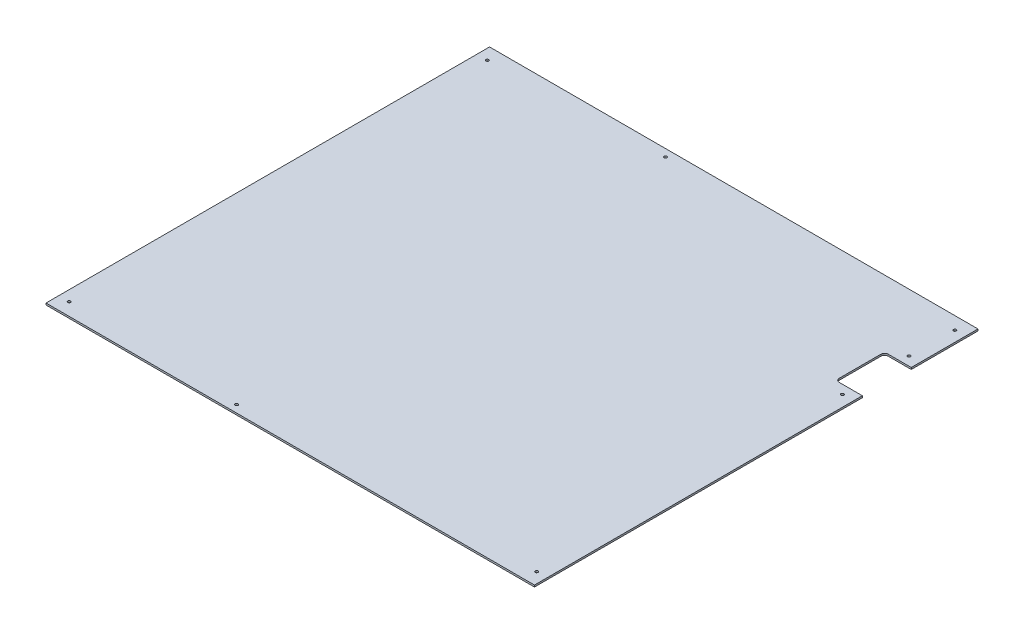
ISO-10303-21;
HEADER;
FILE_DESCRIPTION(('STEP AP214'),'2;1');
FILE_NAME('part.step','',(''),(''),'','','');
FILE_SCHEMA(('AUTOMOTIVE_DESIGN { 1 0 10303 214 1 1 1 1 }'));
ENDSEC;
DATA;
#1=APPLICATION_CONTEXT('core data for automotive mechanical design processes');
#2=APPLICATION_PROTOCOL_DEFINITION('international standard','automotive_design',2000,#1);
#3=PRODUCT_CONTEXT('',#1,'mechanical');
#4=PRODUCT('Part','Part','',(#3));
#5=PRODUCT_RELATED_PRODUCT_CATEGORY('part','',(#4));
#6=PRODUCT_DEFINITION_FORMATION('','',#4);
#7=PRODUCT_DEFINITION_CONTEXT('part definition',#1,'design');
#8=PRODUCT_DEFINITION('design','',#6,#7);
#9=PRODUCT_DEFINITION_SHAPE('','',#8);
#10=(LENGTH_UNIT() NAMED_UNIT(*) SI_UNIT(.MILLI.,.METRE.));
#11=(NAMED_UNIT(*) PLANE_ANGLE_UNIT() SI_UNIT($,.RADIAN.));
#12=(NAMED_UNIT(*) SI_UNIT($,.STERADIAN.) SOLID_ANGLE_UNIT());
#13=UNCERTAINTY_MEASURE_WITH_UNIT(LENGTH_MEASURE(1.E-05),#10,'distance_accuracy_value','');
#14=(GEOMETRIC_REPRESENTATION_CONTEXT(3) GLOBAL_UNCERTAINTY_ASSIGNED_CONTEXT((#13)) GLOBAL_UNIT_ASSIGNED_CONTEXT((#10,
#11,#12)) REPRESENTATION_CONTEXT('',''));
#15=CARTESIAN_POINT('',(0.,0.,0.));
#16=DIRECTION('',(0.,0.,1.));
#17=DIRECTION('',(1.,0.,0.));
#18=AXIS2_PLACEMENT_3D('',#15,#16,#17);
#19=CARTESIAN_POINT('',(549.75,-743.673483458971,-0.750000000000034));
#20=DIRECTION('',(1.,0.,0.));
#21=DIRECTION('',(0.,0.,-1.));
#22=AXIS2_PLACEMENT_3D('',#19,#20,#21);
#23=PLANE('',#22);
#24=DIRECTION('',(0.,1.,0.));
#25=VECTOR('',#24,1.);
#26=CARTESIAN_POINT('',(549.75,-62.6498204307084,-424.25));
#27=LINE('',#26,#25);
#28=CARTESIAN_POINT('',(549.75,0.,-424.25));
#29=VERTEX_POINT('',#28);
#30=CARTESIAN_POINT('',(549.75,2.,-424.25));
#31=VERTEX_POINT('',#30);
#32=EDGE_CURVE('E124',#29,#31,#27,.T.);
#33=ORIENTED_EDGE('',*,*,#32,.F.);
#34=DIRECTION('',(0.,0.,-1.));
#35=VECTOR('',#34,1.);
#36=CARTESIAN_POINT('',(549.75,0.,-0.750000000000034));
#37=LINE('',#36,#35);
#38=CARTESIAN_POINT('',(549.75,0.,-499.25));
#39=VERTEX_POINT('',#38);
#40=EDGE_CURVE('E162',#29,#39,#37,.T.);
#41=ORIENTED_EDGE('',*,*,#40,.T.);
#42=DIRECTION('',(0.,1.,0.));
#43=VECTOR('',#42,1.);
#44=CARTESIAN_POINT('',(549.75,-743.673483458971,-499.25));
#45=LINE('',#44,#43);
#46=CARTESIAN_POINT('',(549.75,2.,-499.25));
#47=VERTEX_POINT('',#46);
#48=EDGE_CURVE('E144',#39,#47,#45,.T.);
#49=ORIENTED_EDGE('',*,*,#48,.T.);
#50=DIRECTION('',(0.,0.,-1.));
#51=VECTOR('',#50,1.);
#52=CARTESIAN_POINT('',(549.75,2.,-0.750000000000034));
#53=LINE('',#52,#51);
#54=EDGE_CURVE('E137',#31,#47,#53,.T.);
#55=ORIENTED_EDGE('',*,*,#54,.F.);
#56=EDGE_LOOP('',(#33,#41,#49,#55));
#57=FACE_BOUND('',#56,.T.);
#58=ADVANCED_FACE('F39',(#57),#23,.T.);
#59=CARTESIAN_POINT('',(0.,2.,0.));
#60=DIRECTION('',(0.,-1.,0.));
#61=DIRECTION('',(0.,0.,-1.));
#62=AXIS2_PLACEMENT_3D('',#59,#60,#61);
#63=PLANE('',#62);
#64=CARTESIAN_POINT('',(206.75,2.,-491.));
#65=DIRECTION('',(0.,1.,0.));
#66=DIRECTION('',(0.,0.,1.));
#67=AXIS2_PLACEMENT_3D('',#64,#65,#66);
#68=CIRCLE('',#67,1.59999999999999);
#69=CARTESIAN_POINT('',(206.75,2.,-489.4));
#70=VERTEX_POINT('',#69);
#71=EDGE_CURVE('E343',#70,#70,#68,.T.);
#72=ORIENTED_EDGE('',*,*,#71,.F.);
#73=EDGE_LOOP('',(#72));
#74=FACE_BOUND('',#73,.T.);
#75=CARTESIAN_POINT('',(206.75,2.,-9.00000000000001));
#76=DIRECTION('',(0.,1.,0.));
#77=DIRECTION('',(0.,0.,1.));
#78=AXIS2_PLACEMENT_3D('',#75,#76,#77);
#79=CIRCLE('',#78,1.59999999999999);
#80=CARTESIAN_POINT('',(206.75,2.,-7.40000000000002));
#81=VERTEX_POINT('',#80);
#82=EDGE_CURVE('E344',#81,#81,#79,.T.);
#83=ORIENTED_EDGE('',*,*,#82,.F.);
#84=EDGE_LOOP('',(#83));
#85=FACE_BOUND('',#84,.T.);
#86=CARTESIAN_POINT('',(537.25,2.,-434.25));
#87=DIRECTION('',(0.,1.,0.));
#88=DIRECTION('',(0.,0.,1.));
#89=AXIS2_PLACEMENT_3D('',#86,#87,#88);
#90=CIRCLE('',#89,1.60000000000002);
#91=CARTESIAN_POINT('',(537.25,2.,-432.65));
#92=VERTEX_POINT('',#91);
#93=EDGE_CURVE('E231',#92,#92,#90,.T.);
#94=ORIENTED_EDGE('',*,*,#93,.F.);
#95=EDGE_LOOP('',(#94));
#96=FACE_BOUND('',#95,.T.);
#97=CARTESIAN_POINT('',(537.25,2.,-359.25));
#98=DIRECTION('',(0.,1.,0.));
#99=DIRECTION('',(0.,0.,1.));
#100=AXIS2_PLACEMENT_3D('',#97,#98,#99);
#101=CIRCLE('',#100,1.60000000000002);
#102=CARTESIAN_POINT('',(537.25,2.,-357.65));
#103=VERTEX_POINT('',#102);
#104=EDGE_CURVE('E241',#103,#103,#101,.T.);
#105=ORIENTED_EDGE('',*,*,#104,.F.);
#106=EDGE_LOOP('',(#105));
#107=FACE_BOUND('',#106,.T.);
#108=CARTESIAN_POINT('',(12.5,2.,-485.));
#109=DIRECTION('',(0.,1.,0.));
#110=DIRECTION('',(0.,0.,1.));
#111=AXIS2_PLACEMENT_3D('',#108,#109,#110);
#112=CIRCLE('',#111,1.55000000000003);
#113=CARTESIAN_POINT('',(12.5,2.,-483.45));
#114=VERTEX_POINT('',#113);
#115=EDGE_CURVE('E186',#114,#114,#112,.T.);
#116=ORIENTED_EDGE('',*,*,#115,.F.);
#117=EDGE_LOOP('',(#116));
#118=FACE_BOUND('',#117,.T.);
#119=CARTESIAN_POINT('',(538.,2.,-485.));
#120=DIRECTION('',(0.,1.,0.));
#121=DIRECTION('',(0.,0.,-1.));
#122=AXIS2_PLACEMENT_3D('',#119,#120,#121);
#123=CIRCLE('',#122,1.55);
#124=CARTESIAN_POINT('',(538.,2.,-486.55));
#125=VERTEX_POINT('',#124);
#126=EDGE_CURVE('E179',#125,#125,#123,.T.);
#127=ORIENTED_EDGE('',*,*,#126,.F.);
#128=EDGE_LOOP('',(#127));
#129=FACE_BOUND('',#128,.T.);
#130=CARTESIAN_POINT('',(538.,2.,-15.0000000000001));
#131=DIRECTION('',(0.,1.,0.));
#132=DIRECTION('',(0.,0.,1.));
#133=AXIS2_PLACEMENT_3D('',#130,#131,#132);
#134=CIRCLE('',#133,1.54999999999999);
#135=CARTESIAN_POINT('',(538.,2.,-13.4500000000001));
#136=VERTEX_POINT('',#135);
#137=EDGE_CURVE('E187',#136,#136,#134,.T.);
#138=ORIENTED_EDGE('',*,*,#137,.F.);
#139=EDGE_LOOP('',(#138));
#140=FACE_BOUND('',#139,.T.);
#141=CARTESIAN_POINT('',(12.5,2.,-15.));
#142=DIRECTION('',(0.,1.,0.));
#143=DIRECTION('',(0.,0.,-1.));
#144=AXIS2_PLACEMENT_3D('',#141,#142,#143);
#145=CIRCLE('',#144,1.55000000000002);
#146=CARTESIAN_POINT('',(12.5,2.,-16.55));
#147=VERTEX_POINT('',#146);
#148=EDGE_CURVE('E169',#147,#147,#145,.T.);
#149=ORIENTED_EDGE('',*,*,#148,.F.);
#150=EDGE_LOOP('',(#149));
#151=FACE_BOUND('',#150,.T.);
#152=DIRECTION('',(0.,0.,1.));
#153=VECTOR('',#152,1.);
#154=CARTESIAN_POINT('',(519.75,2.,-424.25));
#155=LINE('',#154,#153);
#156=CARTESIAN_POINT('',(519.75,2.,-420.25));
#157=VERTEX_POINT('',#156);
#158=CARTESIAN_POINT('',(519.75,2.,-373.25));
#159=VERTEX_POINT('',#158);
#160=EDGE_CURVE('E140',#157,#159,#155,.T.);
#161=ORIENTED_EDGE('',*,*,#160,.F.);
#162=CARTESIAN_POINT('',(523.75,2.,-420.25));
#163=DIRECTION('',(0.,-1.,0.));
#164=DIRECTION('',(0.,0.,-1.));
#165=AXIS2_PLACEMENT_3D('',#162,#163,#164);
#166=CIRCLE('',#165,4.);
#167=CARTESIAN_POINT('',(523.75,2.,-424.25));
#168=VERTEX_POINT('',#167);
#169=EDGE_CURVE('E48',#157,#168,#166,.T.);
#170=ORIENTED_EDGE('',*,*,#169,.T.);
#171=DIRECTION('',(-1.,0.,0.));
#172=VECTOR('',#171,1.);
#173=CARTESIAN_POINT('',(549.75,2.,-424.25));
#174=LINE('',#173,#172);
#175=EDGE_CURVE('E126',#31,#168,#174,.T.);
#176=ORIENTED_EDGE('',*,*,#175,.F.);
#177=ORIENTED_EDGE('',*,*,#54,.T.);
#178=DIRECTION('',(-1.,0.,0.));
#179=VECTOR('',#178,1.);
#180=CARTESIAN_POINT('',(549.75,2.,-499.25));
#181=LINE('',#180,#179);
#182=CARTESIAN_POINT('',(0.75,2.,-499.25));
#183=VERTEX_POINT('',#182);
#184=EDGE_CURVE('E156',#47,#183,#181,.T.);
#185=ORIENTED_EDGE('',*,*,#184,.T.);
#186=DIRECTION('',(0.,0.,1.));
#187=VECTOR('',#186,1.);
#188=CARTESIAN_POINT('',(0.75,2.,-499.25));
#189=LINE('',#188,#187);
#190=CARTESIAN_POINT('',(0.750000000000061,2.,-0.75));
#191=VERTEX_POINT('',#190);
#192=EDGE_CURVE('E177',#183,#191,#189,.T.);
#193=ORIENTED_EDGE('',*,*,#192,.T.);
#194=DIRECTION('',(1.,0.,0.));
#195=VECTOR('',#194,1.);
#196=CARTESIAN_POINT('',(0.750000000000061,2.,-0.75));
#197=LINE('',#196,#195);
#198=CARTESIAN_POINT('',(549.75,2.,-0.750000000000034));
#199=VERTEX_POINT('',#198);
#200=EDGE_CURVE('E173',#191,#199,#197,.T.);
#201=ORIENTED_EDGE('',*,*,#200,.T.);
#202=CARTESIAN_POINT('',(549.75,2.,-369.25));
#203=VERTEX_POINT('',#202);
#204=EDGE_CURVE('E147',#199,#203,#53,.T.);
#205=ORIENTED_EDGE('',*,*,#204,.T.);
#206=DIRECTION('',(1.,0.,0.));
#207=VECTOR('',#206,1.);
#208=CARTESIAN_POINT('',(549.75,2.,-369.25));
#209=LINE('',#208,#207);
#210=CARTESIAN_POINT('',(523.75,2.,-369.25));
#211=VERTEX_POINT('',#210);
#212=EDGE_CURVE('E229',#211,#203,#209,.T.);
#213=ORIENTED_EDGE('',*,*,#212,.F.);
#214=CARTESIAN_POINT('',(523.75,2.,-373.25));
#215=DIRECTION('',(0.,-1.,0.));
#216=DIRECTION('',(0.,0.,-1.));
#217=AXIS2_PLACEMENT_3D('',#214,#215,#216);
#218=CIRCLE('',#217,4.);
#219=EDGE_CURVE('E215',#211,#159,#218,.T.);
#220=ORIENTED_EDGE('',*,*,#219,.T.);
#221=EDGE_LOOP('',(#161,#170,#176,#177,#185,#193,#201,#205,#213,#220));
#222=FACE_BOUND('',#221,.T.);
#223=ADVANCED_FACE('F135',(#74,#85,#96,#107,#118,#129,#140,#151,#222),#63,.F.);
#224=CARTESIAN_POINT('',(0.,0.,0.));
#225=DIRECTION('',(0.,-1.,0.));
#226=DIRECTION('',(0.,0.,-1.));
#227=AXIS2_PLACEMENT_3D('',#224,#225,#226);
#228=PLANE('',#227);
#229=CARTESIAN_POINT('',(206.75,0.,-491.));
#230=DIRECTION('',(0.,-1.,0.));
#231=DIRECTION('',(0.,0.,-1.));
#232=AXIS2_PLACEMENT_3D('',#229,#230,#231);
#233=CIRCLE('',#232,1.59999999999999);
#234=CARTESIAN_POINT('',(206.75,0.,-492.6));
#235=VERTEX_POINT('',#234);
#236=EDGE_CURVE('E244',#235,#235,#233,.F.);
#237=ORIENTED_EDGE('',*,*,#236,.T.);
#238=EDGE_LOOP('',(#237));
#239=FACE_BOUND('',#238,.T.);
#240=CARTESIAN_POINT('',(206.75,0.,-9.00000000000001));
#241=DIRECTION('',(0.,-1.,0.));
#242=DIRECTION('',(0.,0.,-1.));
#243=AXIS2_PLACEMENT_3D('',#240,#241,#242);
#244=CIRCLE('',#243,1.59999999999999);
#245=CARTESIAN_POINT('',(206.75,0.,-10.6));
#246=VERTEX_POINT('',#245);
#247=EDGE_CURVE('E338',#246,#246,#244,.F.);
#248=ORIENTED_EDGE('',*,*,#247,.T.);
#249=EDGE_LOOP('',(#248));
#250=FACE_BOUND('',#249,.T.);
#251=CARTESIAN_POINT('',(537.25,0.,-434.25));
#252=DIRECTION('',(0.,-1.,0.));
#253=DIRECTION('',(0.,0.,-1.));
#254=AXIS2_PLACEMENT_3D('',#251,#252,#253);
#255=CIRCLE('',#254,1.60000000000002);
#256=CARTESIAN_POINT('',(537.25,0.,-435.85));
#257=VERTEX_POINT('',#256);
#258=EDGE_CURVE('E141',#257,#257,#255,.F.);
#259=ORIENTED_EDGE('',*,*,#258,.T.);
#260=EDGE_LOOP('',(#259));
#261=FACE_BOUND('',#260,.T.);
#262=CARTESIAN_POINT('',(537.25,0.,-359.25));
#263=DIRECTION('',(0.,-1.,0.));
#264=DIRECTION('',(0.,0.,-1.));
#265=AXIS2_PLACEMENT_3D('',#262,#263,#264);
#266=CIRCLE('',#265,1.60000000000002);
#267=CARTESIAN_POINT('',(537.25,0.,-360.85));
#268=VERTEX_POINT('',#267);
#269=EDGE_CURVE('E233',#268,#268,#266,.F.);
#270=ORIENTED_EDGE('',*,*,#269,.T.);
#271=EDGE_LOOP('',(#270));
#272=FACE_BOUND('',#271,.T.);
#273=DIRECTION('',(-1.,0.,0.));
#274=VECTOR('',#273,1.);
#275=CARTESIAN_POINT('',(549.75,0.,-424.25));
#276=LINE('',#275,#274);
#277=CARTESIAN_POINT('',(523.75,0.,-424.25));
#278=VERTEX_POINT('',#277);
#279=EDGE_CURVE('E127',#29,#278,#276,.T.);
#280=ORIENTED_EDGE('',*,*,#279,.T.);
#281=CARTESIAN_POINT('',(523.75,0.,-420.25));
#282=DIRECTION('',(0.,-1.,0.));
#283=DIRECTION('',(0.,0.,-1.));
#284=AXIS2_PLACEMENT_3D('',#281,#282,#283);
#285=CIRCLE('',#284,4.);
#286=CARTESIAN_POINT('',(519.75,0.,-420.25));
#287=VERTEX_POINT('',#286);
#288=EDGE_CURVE('E11',#278,#287,#285,.F.);
#289=ORIENTED_EDGE('',*,*,#288,.T.);
#290=DIRECTION('',(0.,0.,1.));
#291=VECTOR('',#290,1.);
#292=CARTESIAN_POINT('',(519.75,0.,-424.25));
#293=LINE('',#292,#291);
#294=CARTESIAN_POINT('',(519.75,0.,-373.25));
#295=VERTEX_POINT('',#294);
#296=EDGE_CURVE('E223',#287,#295,#293,.T.);
#297=ORIENTED_EDGE('',*,*,#296,.T.);
#298=CARTESIAN_POINT('',(523.75,0.,-373.25));
#299=DIRECTION('',(0.,-1.,0.));
#300=DIRECTION('',(0.,0.,-1.));
#301=AXIS2_PLACEMENT_3D('',#298,#299,#300);
#302=CIRCLE('',#301,4.);
#303=CARTESIAN_POINT('',(523.75,0.,-369.25));
#304=VERTEX_POINT('',#303);
#305=EDGE_CURVE('E218',#295,#304,#302,.F.);
#306=ORIENTED_EDGE('',*,*,#305,.T.);
#307=DIRECTION('',(1.,0.,0.));
#308=VECTOR('',#307,1.);
#309=CARTESIAN_POINT('',(549.75,0.,-369.25));
#310=LINE('',#309,#308);
#311=CARTESIAN_POINT('',(549.75,0.,-369.25));
#312=VERTEX_POINT('',#311);
#313=EDGE_CURVE('E225',#304,#312,#310,.T.);
#314=ORIENTED_EDGE('',*,*,#313,.T.);
#315=CARTESIAN_POINT('',(549.75,0.,-0.750000000000034));
#316=VERTEX_POINT('',#315);
#317=EDGE_CURVE('E158',#316,#312,#37,.T.);
#318=ORIENTED_EDGE('',*,*,#317,.F.);
#319=DIRECTION('',(1.,0.,0.));
#320=VECTOR('',#319,1.);
#321=CARTESIAN_POINT('',(0.750000000000061,0.,-0.75));
#322=LINE('',#321,#320);
#323=CARTESIAN_POINT('',(0.750000000000061,0.,-0.75));
#324=VERTEX_POINT('',#323);
#325=EDGE_CURVE('E163',#324,#316,#322,.T.);
#326=ORIENTED_EDGE('',*,*,#325,.F.);
#327=DIRECTION('',(0.,0.,1.));
#328=VECTOR('',#327,1.);
#329=CARTESIAN_POINT('',(0.75,0.,-499.25));
#330=LINE('',#329,#328);
#331=CARTESIAN_POINT('',(0.750000000000028,0.,-499.25));
#332=VERTEX_POINT('',#331);
#333=EDGE_CURVE('E166',#332,#324,#330,.T.);
#334=ORIENTED_EDGE('',*,*,#333,.F.);
#335=DIRECTION('',(-1.,0.,0.));
#336=VECTOR('',#335,1.);
#337=CARTESIAN_POINT('',(549.75,0.,-499.25));
#338=LINE('',#337,#336);
#339=EDGE_CURVE('E161',#39,#332,#338,.T.);
#340=ORIENTED_EDGE('',*,*,#339,.F.);
#341=ORIENTED_EDGE('',*,*,#40,.F.);
#342=EDGE_LOOP('',(#280,#289,#297,#306,#314,#318,#326,#334,#340,#341));
#343=FACE_BOUND('',#342,.T.);
#344=CARTESIAN_POINT('',(12.5,0.,-485.));
#345=DIRECTION('',(0.,-1.,0.));
#346=DIRECTION('',(0.,0.,-1.));
#347=AXIS2_PLACEMENT_3D('',#344,#345,#346);
#348=CIRCLE('',#347,1.55000000000003);
#349=CARTESIAN_POINT('',(12.5,0.,-486.55));
#350=VERTEX_POINT('',#349);
#351=EDGE_CURVE('E199',#350,#350,#348,.F.);
#352=ORIENTED_EDGE('',*,*,#351,.T.);
#353=EDGE_LOOP('',(#352));
#354=FACE_BOUND('',#353,.T.);
#355=CARTESIAN_POINT('',(538.,0.,-485.));
#356=DIRECTION('',(0.,-1.,0.));
#357=DIRECTION('',(0.,0.,-1.));
#358=AXIS2_PLACEMENT_3D('',#355,#356,#357);
#359=CIRCLE('',#358,1.55);
#360=CARTESIAN_POINT('',(538.,0.,-486.55));
#361=VERTEX_POINT('',#360);
#362=EDGE_CURVE('E182',#361,#361,#359,.F.);
#363=ORIENTED_EDGE('',*,*,#362,.T.);
#364=EDGE_LOOP('',(#363));
#365=FACE_BOUND('',#364,.T.);
#366=CARTESIAN_POINT('',(538.,0.,-15.0000000000001));
#367=DIRECTION('',(0.,-1.,0.));
#368=DIRECTION('',(0.,0.,-1.));
#369=AXIS2_PLACEMENT_3D('',#366,#367,#368);
#370=CIRCLE('',#369,1.54999999999999);
#371=CARTESIAN_POINT('',(538.,0.,-16.5500000000001));
#372=VERTEX_POINT('',#371);
#373=EDGE_CURVE('E183',#372,#372,#370,.F.);
#374=ORIENTED_EDGE('',*,*,#373,.T.);
#375=EDGE_LOOP('',(#374));
#376=FACE_BOUND('',#375,.T.);
#377=CARTESIAN_POINT('',(12.5,0.,-15.));
#378=DIRECTION('',(0.,-1.,0.));
#379=DIRECTION('',(0.,0.,-1.));
#380=AXIS2_PLACEMENT_3D('',#377,#378,#379);
#381=CIRCLE('',#380,1.55000000000002);
#382=CARTESIAN_POINT('',(12.5,0.,-16.55));
#383=VERTEX_POINT('',#382);
#384=EDGE_CURVE('E190',#383,#383,#381,.F.);
#385=ORIENTED_EDGE('',*,*,#384,.T.);
#386=EDGE_LOOP('',(#385));
#387=FACE_BOUND('',#386,.T.);
#388=ADVANCED_FACE('F266',(#239,#250,#261,#272,#343,#354,#365,#376,#387),#228,.T.);
#389=CARTESIAN_POINT('',(12.5,-4.38406204335671,-485.));
#390=DIRECTION('',(0.,1.,0.));
#391=DIRECTION('',(0.,0.,1.));
#392=AXIS2_PLACEMENT_3D('',#389,#390,#391);
#393=CYLINDRICAL_SURFACE('',#392,1.55000000000003);
#394=ORIENTED_EDGE('',*,*,#115,.T.);
#395=EDGE_LOOP('',(#394));
#396=FACE_BOUND('',#395,.T.);
#397=ORIENTED_EDGE('',*,*,#351,.F.);
#398=EDGE_LOOP('',(#397));
#399=FACE_BOUND('',#398,.T.);
#400=ADVANCED_FACE('F325',(#396,#399),#393,.F.);
#401=CARTESIAN_POINT('',(538.,-4.38406204335671,-485.));
#402=DIRECTION('',(0.,1.,0.));
#403=DIRECTION('',(0.,0.,1.));
#404=AXIS2_PLACEMENT_3D('',#401,#402,#403);
#405=CYLINDRICAL_SURFACE('',#404,1.55);
#406=ORIENTED_EDGE('',*,*,#126,.T.);
#407=EDGE_LOOP('',(#406));
#408=FACE_BOUND('',#407,.T.);
#409=ORIENTED_EDGE('',*,*,#362,.F.);
#410=EDGE_LOOP('',(#409));
#411=FACE_BOUND('',#410,.T.);
#412=ADVANCED_FACE('F320',(#408,#411),#405,.F.);
#413=CARTESIAN_POINT('',(538.,-4.38406204335671,-15.0000000000001));
#414=DIRECTION('',(0.,1.,0.));
#415=DIRECTION('',(0.,0.,1.));
#416=AXIS2_PLACEMENT_3D('',#413,#414,#415);
#417=CYLINDRICAL_SURFACE('',#416,1.54999999999999);
#418=ORIENTED_EDGE('',*,*,#137,.T.);
#419=EDGE_LOOP('',(#418));
#420=FACE_BOUND('',#419,.T.);
#421=ORIENTED_EDGE('',*,*,#373,.F.);
#422=EDGE_LOOP('',(#421));
#423=FACE_BOUND('',#422,.T.);
#424=ADVANCED_FACE('F314',(#420,#423),#417,.F.);
#425=CARTESIAN_POINT('',(12.5,-4.38406204335671,-15.));
#426=DIRECTION('',(0.,1.,0.));
#427=DIRECTION('',(0.,0.,1.));
#428=AXIS2_PLACEMENT_3D('',#425,#426,#427);
#429=CYLINDRICAL_SURFACE('',#428,1.55000000000002);
#430=ORIENTED_EDGE('',*,*,#148,.T.);
#431=EDGE_LOOP('',(#430));
#432=FACE_BOUND('',#431,.T.);
#433=ORIENTED_EDGE('',*,*,#384,.F.);
#434=EDGE_LOOP('',(#433));
#435=FACE_BOUND('',#434,.T.);
#436=ADVANCED_FACE('F309',(#432,#435),#429,.F.);
#437=DIRECTION('',(0.,1.,0.));
#438=VECTOR('',#437,1.);
#439=CARTESIAN_POINT('',(549.75,-62.6498204307084,-369.25));
#440=LINE('',#439,#438);
#441=EDGE_CURVE('E133',#312,#203,#440,.T.);
#442=ORIENTED_EDGE('',*,*,#441,.T.);
#443=ORIENTED_EDGE('',*,*,#204,.F.);
#444=DIRECTION('',(0.,1.,0.));
#445=VECTOR('',#444,1.);
#446=CARTESIAN_POINT('',(549.75,-743.673483458971,-0.750000000000034));
#447=LINE('',#446,#445);
#448=EDGE_CURVE('E132',#316,#199,#447,.T.);
#449=ORIENTED_EDGE('',*,*,#448,.F.);
#450=ORIENTED_EDGE('',*,*,#317,.T.);
#451=EDGE_LOOP('',(#442,#443,#449,#450));
#452=FACE_BOUND('',#451,.T.);
#453=ADVANCED_FACE('F273',(#452),#23,.T.);
#454=CARTESIAN_POINT('',(0.750000000000061,-743.673483458971,-0.75));
#455=DIRECTION('',(0.,0.,1.));
#456=DIRECTION('',(1.,0.,0.));
#457=AXIS2_PLACEMENT_3D('',#454,#455,#456);
#458=PLANE('',#457);
#459=ORIENTED_EDGE('',*,*,#325,.T.);
#460=ORIENTED_EDGE('',*,*,#448,.T.);
#461=ORIENTED_EDGE('',*,*,#200,.F.);
#462=DIRECTION('',(0.,1.,0.));
#463=VECTOR('',#462,1.);
#464=CARTESIAN_POINT('',(0.750000000000061,-743.673483458971,-0.75));
#465=LINE('',#464,#463);
#466=EDGE_CURVE('E152',#324,#191,#465,.T.);
#467=ORIENTED_EDGE('',*,*,#466,.F.);
#468=EDGE_LOOP('',(#459,#460,#461,#467));
#469=FACE_BOUND('',#468,.T.);
#470=ADVANCED_FACE('F270',(#469),#458,.T.);
#471=CARTESIAN_POINT('',(0.75,-743.673483458971,-499.25));
#472=DIRECTION('',(-1.,0.,0.));
#473=DIRECTION('',(0.,0.,1.));
#474=AXIS2_PLACEMENT_3D('',#471,#472,#473);
#475=PLANE('',#474);
#476=ORIENTED_EDGE('',*,*,#333,.T.);
#477=ORIENTED_EDGE('',*,*,#466,.T.);
#478=ORIENTED_EDGE('',*,*,#192,.F.);
#479=DIRECTION('',(0.,1.,0.));
#480=VECTOR('',#479,1.);
#481=CARTESIAN_POINT('',(0.75,-743.673483458971,-499.25));
#482=LINE('',#481,#480);
#483=EDGE_CURVE('E174',#332,#183,#482,.T.);
#484=ORIENTED_EDGE('',*,*,#483,.F.);
#485=EDGE_LOOP('',(#476,#477,#478,#484));
#486=FACE_BOUND('',#485,.T.);
#487=ADVANCED_FACE('F259',(#486),#475,.T.);
#488=CARTESIAN_POINT('',(549.75,-743.673483458971,-499.25));
#489=DIRECTION('',(0.,0.,-1.));
#490=DIRECTION('',(-1.,0.,0.));
#491=AXIS2_PLACEMENT_3D('',#488,#489,#490);
#492=PLANE('',#491);
#493=ORIENTED_EDGE('',*,*,#339,.T.);
#494=ORIENTED_EDGE('',*,*,#483,.T.);
#495=ORIENTED_EDGE('',*,*,#184,.F.);
#496=ORIENTED_EDGE('',*,*,#48,.F.);
#497=EDGE_LOOP('',(#493,#494,#495,#496));
#498=FACE_BOUND('',#497,.T.);
#499=ADVANCED_FACE('F261',(#498),#492,.T.);
#500=CARTESIAN_POINT('',(549.75,-62.6498204307084,-424.25));
#501=DIRECTION('',(0.,0.,-1.));
#502=DIRECTION('',(-1.,0.,0.));
#503=AXIS2_PLACEMENT_3D('',#500,#501,#502);
#504=PLANE('',#503);
#505=ORIENTED_EDGE('',*,*,#175,.T.);
#506=DIRECTION('',(0.,1.,0.));
#507=VECTOR('',#506,1.);
#508=CARTESIAN_POINT('',(523.75,0.,-424.25));
#509=LINE('',#508,#507);
#510=EDGE_CURVE('E58',#168,#278,#509,.F.);
#511=ORIENTED_EDGE('',*,*,#510,.T.);
#512=ORIENTED_EDGE('',*,*,#279,.F.);
#513=ORIENTED_EDGE('',*,*,#32,.T.);
#514=EDGE_LOOP('',(#505,#511,#512,#513));
#515=FACE_BOUND('',#514,.T.);
#516=ADVANCED_FACE('F125',(#515),#504,.F.);
#517=CARTESIAN_POINT('',(519.75,-62.6498204307084,-424.25));
#518=DIRECTION('',(-1.,0.,0.));
#519=DIRECTION('',(0.,0.,1.));
#520=AXIS2_PLACEMENT_3D('',#517,#518,#519);
#521=PLANE('',#520);
#522=ORIENTED_EDGE('',*,*,#160,.T.);
#523=DIRECTION('',(0.,1.,0.));
#524=VECTOR('',#523,1.);
#525=CARTESIAN_POINT('',(519.75,0.,-373.25));
#526=LINE('',#525,#524);
#527=EDGE_CURVE('E210',#159,#295,#526,.F.);
#528=ORIENTED_EDGE('',*,*,#527,.T.);
#529=ORIENTED_EDGE('',*,*,#296,.F.);
#530=DIRECTION('',(0.,1.,0.));
#531=VECTOR('',#530,1.);
#532=CARTESIAN_POINT('',(519.75,2.,-420.25));
#533=LINE('',#532,#531);
#534=EDGE_CURVE('E206',#287,#157,#533,.T.);
#535=ORIENTED_EDGE('',*,*,#534,.T.);
#536=EDGE_LOOP('',(#522,#528,#529,#535));
#537=FACE_BOUND('',#536,.T.);
#538=ADVANCED_FACE('F286',(#537),#521,.F.);
#539=CARTESIAN_POINT('',(549.75,-62.6498204307084,-369.25));
#540=DIRECTION('',(0.,0.,1.));
#541=DIRECTION('',(1.,0.,0.));
#542=AXIS2_PLACEMENT_3D('',#539,#540,#541);
#543=PLANE('',#542);
#544=ORIENTED_EDGE('',*,*,#313,.F.);
#545=DIRECTION('',(0.,1.,0.));
#546=VECTOR('',#545,1.);
#547=CARTESIAN_POINT('',(523.75,2.,-369.25));
#548=LINE('',#547,#546);
#549=EDGE_CURVE('E202',#304,#211,#548,.T.);
#550=ORIENTED_EDGE('',*,*,#549,.T.);
#551=ORIENTED_EDGE('',*,*,#212,.T.);
#552=ORIENTED_EDGE('',*,*,#441,.F.);
#553=EDGE_LOOP('',(#544,#550,#551,#552));
#554=FACE_BOUND('',#553,.T.);
#555=ADVANCED_FACE('F278',(#554),#543,.F.);
#556=CARTESIAN_POINT('',(523.75,-62.6498204307084,-373.25));
#557=DIRECTION('',(0.,-1.,0.));
#558=DIRECTION('',(0.,0.,-1.));
#559=AXIS2_PLACEMENT_3D('',#556,#557,#558);
#560=CYLINDRICAL_SURFACE('',#559,4.);
#561=ORIENTED_EDGE('',*,*,#305,.F.);
#562=ORIENTED_EDGE('',*,*,#527,.F.);
#563=ORIENTED_EDGE('',*,*,#219,.F.);
#564=ORIENTED_EDGE('',*,*,#549,.F.);
#565=EDGE_LOOP('',(#561,#562,#563,#564));
#566=FACE_BOUND('',#565,.T.);
#567=ADVANCED_FACE('F282',(#566),#560,.F.);
#568=CARTESIAN_POINT('',(523.75,-62.6498204307084,-420.25));
#569=DIRECTION('',(0.,-1.,0.));
#570=DIRECTION('',(0.,0.,-1.));
#571=AXIS2_PLACEMENT_3D('',#568,#569,#570);
#572=CYLINDRICAL_SURFACE('',#571,4.);
#573=ORIENTED_EDGE('',*,*,#288,.F.);
#574=ORIENTED_EDGE('',*,*,#510,.F.);
#575=ORIENTED_EDGE('',*,*,#169,.F.);
#576=ORIENTED_EDGE('',*,*,#534,.F.);
#577=EDGE_LOOP('',(#573,#574,#575,#576));
#578=FACE_BOUND('',#577,.T.);
#579=ADVANCED_FACE('F41',(#578),#572,.F.);
#580=CARTESIAN_POINT('',(537.25,-4.52548339959396,-359.25));
#581=DIRECTION('',(0.,1.,0.));
#582=DIRECTION('',(0.,0.,1.));
#583=AXIS2_PLACEMENT_3D('',#580,#581,#582);
#584=CYLINDRICAL_SURFACE('',#583,1.60000000000002);
#585=ORIENTED_EDGE('',*,*,#104,.T.);
#586=EDGE_LOOP('',(#585));
#587=FACE_BOUND('',#586,.T.);
#588=ORIENTED_EDGE('',*,*,#269,.F.);
#589=EDGE_LOOP('',(#588));
#590=FACE_BOUND('',#589,.T.);
#591=ADVANCED_FACE('F291',(#587,#590),#584,.F.);
#592=CARTESIAN_POINT('',(537.25,-4.52548339959396,-434.25));
#593=DIRECTION('',(0.,1.,0.));
#594=DIRECTION('',(0.,0.,1.));
#595=AXIS2_PLACEMENT_3D('',#592,#593,#594);
#596=CYLINDRICAL_SURFACE('',#595,1.60000000000002);
#597=ORIENTED_EDGE('',*,*,#93,.T.);
#598=EDGE_LOOP('',(#597));
#599=FACE_BOUND('',#598,.T.);
#600=ORIENTED_EDGE('',*,*,#258,.F.);
#601=EDGE_LOOP('',(#600));
#602=FACE_BOUND('',#601,.T.);
#603=ADVANCED_FACE('F296',(#599,#602),#596,.F.);
#604=CARTESIAN_POINT('',(206.75,-4.52548339959388,-9.00000000000001));
#605=DIRECTION('',(0.,1.,0.));
#606=DIRECTION('',(0.,0.,1.));
#607=AXIS2_PLACEMENT_3D('',#604,#605,#606);
#608=CYLINDRICAL_SURFACE('',#607,1.59999999999999);
#609=ORIENTED_EDGE('',*,*,#82,.T.);
#610=EDGE_LOOP('',(#609));
#611=FACE_BOUND('',#610,.T.);
#612=ORIENTED_EDGE('',*,*,#247,.F.);
#613=EDGE_LOOP('',(#612));
#614=FACE_BOUND('',#613,.T.);
#615=ADVANCED_FACE('F352',(#611,#614),#608,.F.);
#616=CARTESIAN_POINT('',(206.75,-4.52548339959388,-491.));
#617=DIRECTION('',(0.,1.,0.));
#618=DIRECTION('',(0.,0.,1.));
#619=AXIS2_PLACEMENT_3D('',#616,#617,#618);
#620=CYLINDRICAL_SURFACE('',#619,1.59999999999999);
#621=ORIENTED_EDGE('',*,*,#71,.T.);
#622=EDGE_LOOP('',(#621));
#623=FACE_BOUND('',#622,.T.);
#624=ORIENTED_EDGE('',*,*,#236,.F.);
#625=EDGE_LOOP('',(#624));
#626=FACE_BOUND('',#625,.T.);
#627=ADVANCED_FACE('F487',(#623,#626),#620,.F.);
#628=CLOSED_SHELL('',(#58,#223,#388,#400,#412,#424,#436,#453,#470,#487,#499,#516,#538,#555,#567,
#579,#591,#603,#615,#627));
#629=MANIFOLD_SOLID_BREP('B2',#628);
#630=ADVANCED_BREP_SHAPE_REPRESENTATION('',(#18,#629),#14);
#631=SHAPE_DEFINITION_REPRESENTATION(#9,#630);
ENDSEC;
END-ISO-10303-21;
